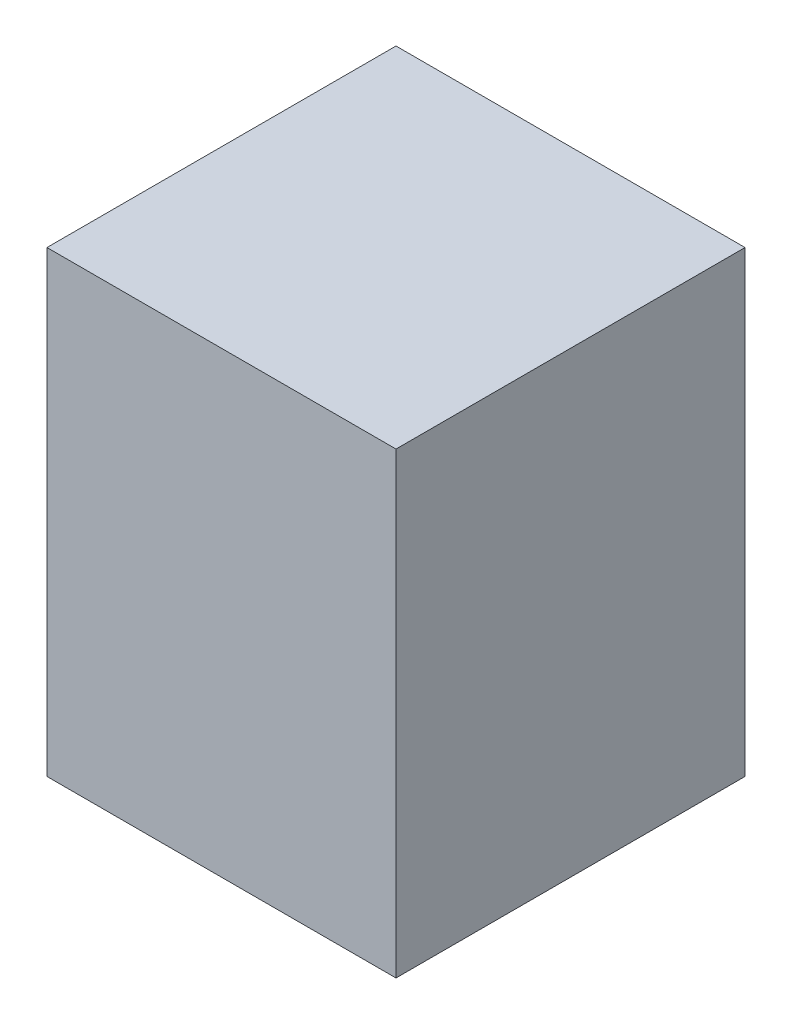
ISO-10303-21;
HEADER;
FILE_DESCRIPTION(('STEP AP214'),'2;1');
FILE_NAME('part.step','',(''),(''),'','','');
FILE_SCHEMA(('AUTOMOTIVE_DESIGN { 1 0 10303 214 1 1 1 1 }'));
ENDSEC;
DATA;
#1=APPLICATION_CONTEXT('core data for automotive mechanical design processes');
#2=APPLICATION_PROTOCOL_DEFINITION('international standard','automotive_design',2000,#1);
#3=PRODUCT_CONTEXT('',#1,'mechanical');
#4=PRODUCT('Part','Part','',(#3));
#5=PRODUCT_RELATED_PRODUCT_CATEGORY('part','',(#4));
#6=PRODUCT_DEFINITION_FORMATION('','',#4);
#7=PRODUCT_DEFINITION_CONTEXT('part definition',#1,'design');
#8=PRODUCT_DEFINITION('design','',#6,#7);
#9=PRODUCT_DEFINITION_SHAPE('','',#8);
#10=(LENGTH_UNIT() NAMED_UNIT(*) SI_UNIT(.MILLI.,.METRE.));
#11=(NAMED_UNIT(*) PLANE_ANGLE_UNIT() SI_UNIT($,.RADIAN.));
#12=(NAMED_UNIT(*) SI_UNIT($,.STERADIAN.) SOLID_ANGLE_UNIT());
#13=UNCERTAINTY_MEASURE_WITH_UNIT(LENGTH_MEASURE(1.E-05),#10,'distance_accuracy_value','');
#14=(GEOMETRIC_REPRESENTATION_CONTEXT(3) GLOBAL_UNCERTAINTY_ASSIGNED_CONTEXT((#13)) GLOBAL_UNIT_ASSIGNED_CONTEXT((#10,
#11,#12)) REPRESENTATION_CONTEXT('',''));
#15=CARTESIAN_POINT('',(0.,0.,0.));
#16=DIRECTION('',(0.,0.,1.));
#17=DIRECTION('',(1.,0.,0.));
#18=AXIS2_PLACEMENT_3D('',#15,#16,#17);
#19=CARTESIAN_POINT('',(8.,21.,8.));
#20=DIRECTION('',(-1.,0.,0.));
#21=DIRECTION('',(0.,0.,1.));
#22=AXIS2_PLACEMENT_3D('',#19,#20,#21);
#23=PLANE('',#22);
#24=DIRECTION('',(0.,0.,-1.));
#25=VECTOR('',#24,1.);
#26=CARTESIAN_POINT('',(8.,0.,8.));
#27=LINE('',#26,#25);
#28=CARTESIAN_POINT('',(8.,0.,8.));
#29=VERTEX_POINT('',#28);
#30=CARTESIAN_POINT('',(8.,0.,-8.));
#31=VERTEX_POINT('',#30);
#32=EDGE_CURVE('E96',#29,#31,#27,.T.);
#33=ORIENTED_EDGE('',*,*,#32,.T.);
#34=DIRECTION('',(0.,-1.,0.));
#35=VECTOR('',#34,1.);
#36=CARTESIAN_POINT('',(8.,21.,-8.));
#37=LINE('',#36,#35);
#38=CARTESIAN_POINT('',(8.,21.,-8.));
#39=VERTEX_POINT('',#38);
#40=EDGE_CURVE('E11',#39,#31,#37,.T.);
#41=ORIENTED_EDGE('',*,*,#40,.F.);
#42=DIRECTION('',(0.,0.,-1.));
#43=VECTOR('',#42,1.);
#44=CARTESIAN_POINT('',(8.,21.,8.));
#45=LINE('',#44,#43);
#46=CARTESIAN_POINT('',(8.,21.,8.));
#47=VERTEX_POINT('',#46);
#48=EDGE_CURVE('E84',#47,#39,#45,.T.);
#49=ORIENTED_EDGE('',*,*,#48,.F.);
#50=DIRECTION('',(0.,-1.,0.));
#51=VECTOR('',#50,1.);
#52=CARTESIAN_POINT('',(8.,21.,8.));
#53=LINE('',#52,#51);
#54=EDGE_CURVE('E92',#47,#29,#53,.T.);
#55=ORIENTED_EDGE('',*,*,#54,.T.);
#56=EDGE_LOOP('',(#33,#41,#49,#55));
#57=FACE_BOUND('',#56,.T.);
#58=ADVANCED_FACE('F33',(#57),#23,.F.);
#59=CARTESIAN_POINT('',(-8.,21.,-8.));
#60=DIRECTION('',(0.,0.,1.));
#61=DIRECTION('',(1.,0.,0.));
#62=AXIS2_PLACEMENT_3D('',#59,#60,#61);
#63=PLANE('',#62);
#64=DIRECTION('',(-1.,0.,0.));
#65=VECTOR('',#64,1.);
#66=CARTESIAN_POINT('',(-8.,0.,-8.));
#67=LINE('',#66,#65);
#68=CARTESIAN_POINT('',(-8.,0.,-8.));
#69=VERTEX_POINT('',#68);
#70=EDGE_CURVE('E88',#31,#69,#67,.T.);
#71=ORIENTED_EDGE('',*,*,#70,.T.);
#72=DIRECTION('',(0.,-1.,0.));
#73=VECTOR('',#72,1.);
#74=CARTESIAN_POINT('',(-8.,21.,-8.));
#75=LINE('',#74,#73);
#76=CARTESIAN_POINT('',(-8.,21.,-8.));
#77=VERTEX_POINT('',#76);
#78=EDGE_CURVE('E41',#77,#69,#75,.T.);
#79=ORIENTED_EDGE('',*,*,#78,.F.);
#80=DIRECTION('',(-1.,0.,0.));
#81=VECTOR('',#80,1.);
#82=CARTESIAN_POINT('',(-8.,21.,-8.));
#83=LINE('',#82,#81);
#84=EDGE_CURVE('E79',#39,#77,#83,.T.);
#85=ORIENTED_EDGE('',*,*,#84,.F.);
#86=ORIENTED_EDGE('',*,*,#40,.T.);
#87=EDGE_LOOP('',(#71,#79,#85,#86));
#88=FACE_BOUND('',#87,.T.);
#89=ADVANCED_FACE('F87',(#88),#63,.F.);
#90=CARTESIAN_POINT('',(-8.,21.,8.));
#91=DIRECTION('',(1.,0.,0.));
#92=DIRECTION('',(0.,0.,-1.));
#93=AXIS2_PLACEMENT_3D('',#90,#91,#92);
#94=PLANE('',#93);
#95=DIRECTION('',(0.,0.,1.));
#96=VECTOR('',#95,1.);
#97=CARTESIAN_POINT('',(-8.,0.,8.));
#98=LINE('',#97,#96);
#99=CARTESIAN_POINT('',(-8.,0.,8.));
#100=VERTEX_POINT('',#99);
#101=EDGE_CURVE('E66',#69,#100,#98,.T.);
#102=ORIENTED_EDGE('',*,*,#101,.T.);
#103=DIRECTION('',(0.,-1.,0.));
#104=VECTOR('',#103,1.);
#105=CARTESIAN_POINT('',(-8.,21.,8.));
#106=LINE('',#105,#104);
#107=CARTESIAN_POINT('',(-8.,21.,8.));
#108=VERTEX_POINT('',#107);
#109=EDGE_CURVE('E89',#108,#100,#106,.T.);
#110=ORIENTED_EDGE('',*,*,#109,.F.);
#111=DIRECTION('',(0.,0.,1.));
#112=VECTOR('',#111,1.);
#113=CARTESIAN_POINT('',(-8.,21.,8.));
#114=LINE('',#113,#112);
#115=EDGE_CURVE('E82',#77,#108,#114,.T.);
#116=ORIENTED_EDGE('',*,*,#115,.F.);
#117=ORIENTED_EDGE('',*,*,#78,.T.);
#118=EDGE_LOOP('',(#102,#110,#116,#117));
#119=FACE_BOUND('',#118,.T.);
#120=ADVANCED_FACE('F90',(#119),#94,.F.);
#121=CARTESIAN_POINT('',(-8.,21.,8.));
#122=DIRECTION('',(0.,0.,-1.));
#123=DIRECTION('',(-1.,0.,0.));
#124=AXIS2_PLACEMENT_3D('',#121,#122,#123);
#125=PLANE('',#124);
#126=DIRECTION('',(1.,0.,0.));
#127=VECTOR('',#126,1.);
#128=CARTESIAN_POINT('',(-8.,0.,8.));
#129=LINE('',#128,#127);
#130=EDGE_CURVE('E72',#100,#29,#129,.T.);
#131=ORIENTED_EDGE('',*,*,#130,.T.);
#132=ORIENTED_EDGE('',*,*,#54,.F.);
#133=DIRECTION('',(1.,0.,0.));
#134=VECTOR('',#133,1.);
#135=CARTESIAN_POINT('',(-8.,21.,8.));
#136=LINE('',#135,#134);
#137=EDGE_CURVE('E49',#108,#47,#136,.T.);
#138=ORIENTED_EDGE('',*,*,#137,.F.);
#139=ORIENTED_EDGE('',*,*,#109,.T.);
#140=EDGE_LOOP('',(#131,#132,#138,#139));
#141=FACE_BOUND('',#140,.T.);
#142=ADVANCED_FACE('F103',(#141),#125,.F.);
#143=CARTESIAN_POINT('',(0.,21.,0.));
#144=DIRECTION('',(0.,-1.,0.));
#145=DIRECTION('',(0.,0.,-1.));
#146=AXIS2_PLACEMENT_3D('',#143,#144,#145);
#147=PLANE('',#146);
#148=ORIENTED_EDGE('',*,*,#48,.T.);
#149=ORIENTED_EDGE('',*,*,#84,.T.);
#150=ORIENTED_EDGE('',*,*,#115,.T.);
#151=ORIENTED_EDGE('',*,*,#137,.T.);
#152=EDGE_LOOP('',(#148,#149,#150,#151));
#153=FACE_BOUND('',#152,.T.);
#154=ADVANCED_FACE('F80',(#153),#147,.F.);
#155=CARTESIAN_POINT('',(0.,0.,0.));
#156=DIRECTION('',(0.,-1.,0.));
#157=DIRECTION('',(0.,0.,-1.));
#158=AXIS2_PLACEMENT_3D('',#155,#156,#157);
#159=PLANE('',#158);
#160=ORIENTED_EDGE('',*,*,#32,.F.);
#161=ORIENTED_EDGE('',*,*,#130,.F.);
#162=ORIENTED_EDGE('',*,*,#101,.F.);
#163=ORIENTED_EDGE('',*,*,#70,.F.);
#164=EDGE_LOOP('',(#160,#161,#162,#163));
#165=FACE_BOUND('',#164,.T.);
#166=ADVANCED_FACE('F106',(#165),#159,.T.);
#167=CLOSED_SHELL('',(#58,#89,#120,#142,#154,#166));
#168=MANIFOLD_SOLID_BREP('B2',#167);
#169=ADVANCED_BREP_SHAPE_REPRESENTATION('',(#18,#168),#14);
#170=SHAPE_DEFINITION_REPRESENTATION(#9,#169);
ENDSEC;
END-ISO-10303-21;
